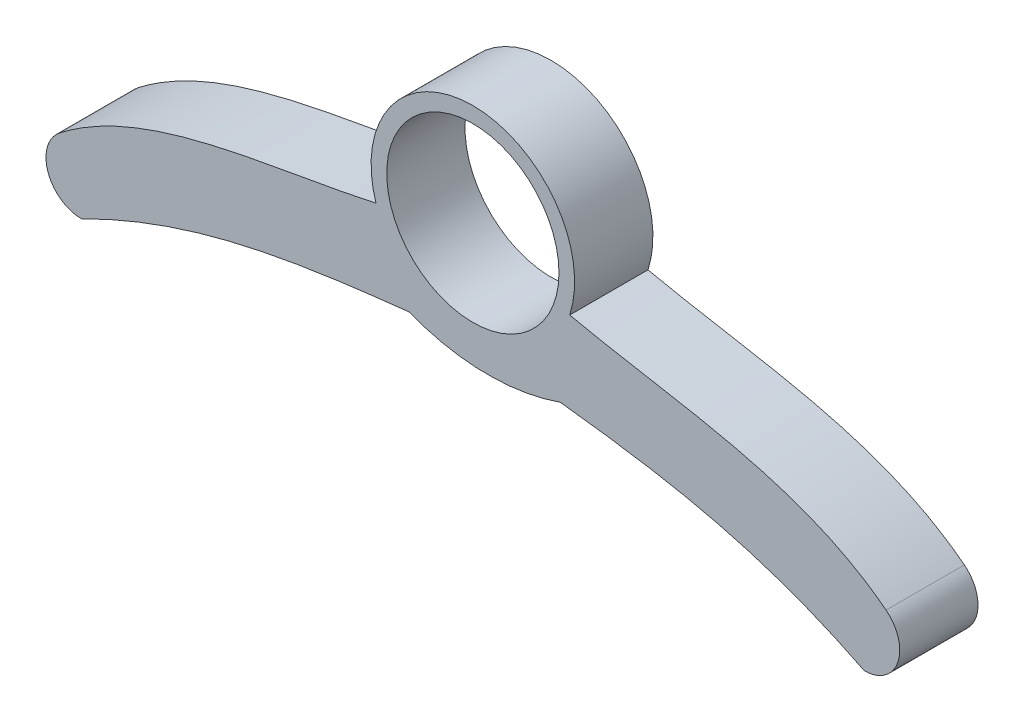
ISO-10303-21;
HEADER;
FILE_DESCRIPTION(('STEP AP214'),'2;1');
FILE_NAME('part.step','',(''),(''),'','','');
FILE_SCHEMA(('AUTOMOTIVE_DESIGN { 1 0 10303 214 1 1 1 1 }'));
ENDSEC;
DATA;
#1=APPLICATION_CONTEXT('core data for automotive mechanical design processes');
#2=APPLICATION_PROTOCOL_DEFINITION('international standard','automotive_design',2000,#1);
#3=PRODUCT_CONTEXT('',#1,'mechanical');
#4=PRODUCT('Part','Part','',(#3));
#5=PRODUCT_RELATED_PRODUCT_CATEGORY('part','',(#4));
#6=PRODUCT_DEFINITION_FORMATION('','',#4);
#7=PRODUCT_DEFINITION_CONTEXT('part definition',#1,'design');
#8=PRODUCT_DEFINITION('design','',#6,#7);
#9=PRODUCT_DEFINITION_SHAPE('','',#8);
#10=(LENGTH_UNIT() NAMED_UNIT(*) SI_UNIT(.MILLI.,.METRE.));
#11=(NAMED_UNIT(*) PLANE_ANGLE_UNIT() SI_UNIT($,.RADIAN.));
#12=(NAMED_UNIT(*) SI_UNIT($,.STERADIAN.) SOLID_ANGLE_UNIT());
#13=UNCERTAINTY_MEASURE_WITH_UNIT(LENGTH_MEASURE(1.E-05),#10,'distance_accuracy_value','');
#14=(GEOMETRIC_REPRESENTATION_CONTEXT(3) GLOBAL_UNCERTAINTY_ASSIGNED_CONTEXT((#13)) GLOBAL_UNIT_ASSIGNED_CONTEXT((#10,
#11,#12)) REPRESENTATION_CONTEXT('',''));
#15=CARTESIAN_POINT('',(0.,0.,0.));
#16=DIRECTION('',(0.,0.,1.));
#17=DIRECTION('',(1.,0.,0.));
#18=AXIS2_PLACEMENT_3D('',#15,#16,#17);
#19=CARTESIAN_POINT('',(-49.9999999999999,-20.,10.));
#20=DIRECTION('',(0.,0.,-1.));
#21=DIRECTION('',(-1.,0.,0.));
#22=AXIS2_PLACEMENT_3D('',#19,#20,#21);
#23=CYLINDRICAL_SURFACE('',#22,4.52880517586229);
#24=CARTESIAN_POINT('',(-49.9999999999999,-20.,0.));
#25=DIRECTION('',(0.,0.,1.));
#26=DIRECTION('',(1.,0.,0.));
#27=AXIS2_PLACEMENT_3D('',#24,#25,#26);
#28=CIRCLE('',#27,4.52880517586229);
#29=CARTESIAN_POINT('',(-52.7829726265033,-16.4271664352996,0.));
#30=VERTEX_POINT('',#29);
#31=CARTESIAN_POINT('',(-50.,-24.5288051758623,0.));
#32=VERTEX_POINT('',#31);
#33=EDGE_CURVE('E181',#30,#32,#28,.T.);
#34=ORIENTED_EDGE('',*,*,#33,.T.);
#35=DIRECTION('',(0.,0.,-1.));
#36=VECTOR('',#35,1.);
#37=CARTESIAN_POINT('',(-50.,-24.5288051758623,10.));
#38=LINE('',#37,#36);
#39=CARTESIAN_POINT('',(-50.,-24.5288051758623,10.));
#40=VERTEX_POINT('',#39);
#41=EDGE_CURVE('E11',#40,#32,#38,.T.);
#42=ORIENTED_EDGE('',*,*,#41,.F.);
#43=CARTESIAN_POINT('',(-49.9999999999999,-20.,10.));
#44=DIRECTION('',(0.,0.,1.));
#45=DIRECTION('',(1.,0.,0.));
#46=AXIS2_PLACEMENT_3D('',#43,#44,#45);
#47=CIRCLE('',#46,4.52880517586229);
#48=CARTESIAN_POINT('',(-52.7829726265033,-16.4271664352996,10.));
#49=VERTEX_POINT('',#48);
#50=EDGE_CURVE('E167',#49,#40,#47,.T.);
#51=ORIENTED_EDGE('',*,*,#50,.F.);
#52=DIRECTION('',(0.,0.,-1.));
#53=VECTOR('',#52,1.);
#54=CARTESIAN_POINT('',(-52.7829726265033,-16.4271664352996,10.));
#55=LINE('',#54,#53);
#56=EDGE_CURVE('E183',#49,#30,#55,.T.);
#57=ORIENTED_EDGE('',*,*,#56,.T.);
#58=EDGE_LOOP('',(#34,#42,#51,#57));
#59=FACE_BOUND('',#58,.T.);
#60=ADVANCED_FACE('F35',(#59),#23,.T.);
#61=CARTESIAN_POINT('',(-50.,-24.5288051758623,10.));
#62=CARTESIAN_POINT('',(-33.0715845553346,-16.0074155927241,10.));
#63=CARTESIAN_POINT('',(-18.4568769413616,-15.1064743602897,10.));
#64=CARTESIAN_POINT('',(0.,-13.,10.));
#65=B_SPLINE_CURVE_WITH_KNOTS('',3,(#61,#62,#63,#64),.UNSPECIFIED.,.F.,.F.,(4,4),(0.,1.),.UNSPECIFIED.);
#66=DIRECTION('',(0.,0.,-1.));
#67=VECTOR('',#66,1.);
#68=SURFACE_OF_LINEAR_EXTRUSION('',#65,#67);
#69=CARTESIAN_POINT('',(-50.,-24.5288051758623,0.));
#70=CARTESIAN_POINT('',(-33.0715845553346,-16.0074155927241,0.));
#71=CARTESIAN_POINT('',(-18.4568769413616,-15.1064743602897,0.));
#72=CARTESIAN_POINT('',(0.,-13.,0.));
#73=B_SPLINE_CURVE_WITH_KNOTS('',3,(#69,#70,#71,#72),.UNSPECIFIED.,.F.,.F.,(4,4),(0.,1.),.UNSPECIFIED.);
#74=CARTESIAN_POINT('',(-8.16898612413524,-13.9076929567843,0.));
#75=VERTEX_POINT('',#74);
#76=EDGE_CURVE('E185',#32,#75,#73,.T.);
#77=ORIENTED_EDGE('',*,*,#76,.T.);
#78=DIRECTION('',(0.,0.,-1.));
#79=VECTOR('',#78,1.);
#80=CARTESIAN_POINT('',(-8.16898612413524,-13.9076929567843,10.));
#81=LINE('',#80,#79);
#82=CARTESIAN_POINT('',(-8.16898612413524,-13.9076929567843,10.));
#83=VERTEX_POINT('',#82);
#84=EDGE_CURVE('E44',#83,#75,#81,.T.);
#85=ORIENTED_EDGE('',*,*,#84,.F.);
#86=EDGE_CURVE('E94',#40,#83,#65,.T.);
#87=ORIENTED_EDGE('',*,*,#86,.F.);
#88=ORIENTED_EDGE('',*,*,#41,.T.);
#89=EDGE_LOOP('',(#77,#85,#87,#88));
#90=FACE_BOUND('',#89,.T.);
#91=ADVANCED_FACE('F172',(#90),#68,.F.);
#92=CARTESIAN_POINT('',(1.95293040160297,11.9761529949238,10.));
#93=DIRECTION('',(0.,0.,-1.));
#94=DIRECTION('',(-1.,0.,0.));
#95=AXIS2_PLACEMENT_3D('',#92,#93,#94);
#96=CYLINDRICAL_SURFACE('',#95,27.7925651102191);
#97=CARTESIAN_POINT('',(1.95293040160297,11.9761529949238,0.));
#98=DIRECTION('',(0.,0.,1.));
#99=DIRECTION('',(1.,0.,0.));
#100=AXIS2_PLACEMENT_3D('',#97,#98,#99);
#101=CIRCLE('',#100,27.7925651102191);
#102=CARTESIAN_POINT('',(11.159249547059,-14.2473167068105,0.));
#103=VERTEX_POINT('',#102);
#104=EDGE_CURVE('E188',#75,#103,#101,.T.);
#105=ORIENTED_EDGE('',*,*,#104,.T.);
#106=DIRECTION('',(0.,0.,-1.));
#107=VECTOR('',#106,1.);
#108=CARTESIAN_POINT('',(11.159249547059,-14.2473167068105,10.));
#109=LINE('',#108,#107);
#110=CARTESIAN_POINT('',(11.159249547059,-14.2473167068105,10.));
#111=VERTEX_POINT('',#110);
#112=EDGE_CURVE('E230',#111,#103,#109,.T.);
#113=ORIENTED_EDGE('',*,*,#112,.F.);
#114=CARTESIAN_POINT('',(1.95293040160297,11.9761529949238,10.));
#115=DIRECTION('',(0.,0.,1.));
#116=DIRECTION('',(1.,0.,0.));
#117=AXIS2_PLACEMENT_3D('',#114,#115,#116);
#118=CIRCLE('',#117,27.7925651102191);
#119=EDGE_CURVE('E158',#83,#111,#118,.T.);
#120=ORIENTED_EDGE('',*,*,#119,.F.);
#121=ORIENTED_EDGE('',*,*,#84,.T.);
#122=EDGE_LOOP('',(#105,#113,#120,#121));
#123=FACE_BOUND('',#122,.T.);
#124=ADVANCED_FACE('F150',(#123),#96,.T.);
#125=CARTESIAN_POINT('',(50.,-24.5288051758623,10.));
#126=CARTESIAN_POINT('',(33.0715845553346,-16.0074155927241,10.));
#127=CARTESIAN_POINT('',(18.4568769413616,-15.1064743602897,10.));
#128=CARTESIAN_POINT('',(0.,-13.,10.));
#129=B_SPLINE_CURVE_WITH_KNOTS('',3,(#125,#126,#127,#128),.UNSPECIFIED.,.F.,.F.,(4,4),(0.,1.),.UNSPECIFIED.);
#130=DIRECTION('',(0.,0.,-1.));
#131=VECTOR('',#130,1.);
#132=SURFACE_OF_LINEAR_EXTRUSION('',#129,#131);
#133=CARTESIAN_POINT('',(50.,-24.5288051758623,0.));
#134=CARTESIAN_POINT('',(33.0715845553346,-16.0074155927241,0.));
#135=CARTESIAN_POINT('',(18.4568769413616,-15.1064743602897,0.));
#136=CARTESIAN_POINT('',(0.,-13.,0.));
#137=B_SPLINE_CURVE_WITH_KNOTS('',3,(#133,#134,#135,#136),.UNSPECIFIED.,.F.,.F.,(4,4),(0.,1.),.UNSPECIFIED.);
#138=CARTESIAN_POINT('',(50.,-24.5288051758623,0.));
#139=VERTEX_POINT('',#138);
#140=EDGE_CURVE('E200',#139,#103,#137,.T.);
#141=ORIENTED_EDGE('',*,*,#140,.F.);
#142=DIRECTION('',(0.,0.,-1.));
#143=VECTOR('',#142,1.);
#144=CARTESIAN_POINT('',(50.,-24.5288051758623,10.));
#145=LINE('',#144,#143);
#146=CARTESIAN_POINT('',(50.,-24.5288051758623,10.));
#147=VERTEX_POINT('',#146);
#148=EDGE_CURVE('E228',#147,#139,#145,.T.);
#149=ORIENTED_EDGE('',*,*,#148,.F.);
#150=EDGE_CURVE('E128',#147,#111,#129,.T.);
#151=ORIENTED_EDGE('',*,*,#150,.T.);
#152=ORIENTED_EDGE('',*,*,#112,.T.);
#153=EDGE_LOOP('',(#141,#149,#151,#152));
#154=FACE_BOUND('',#153,.T.);
#155=ADVANCED_FACE('F146',(#154),#132,.T.);
#156=CARTESIAN_POINT('',(49.9999999999999,-20.,10.));
#157=DIRECTION('',(0.,0.,-1.));
#158=DIRECTION('',(-1.,0.,0.));
#159=AXIS2_PLACEMENT_3D('',#156,#157,#158);
#160=CYLINDRICAL_SURFACE('',#159,4.52880517586229);
#161=CARTESIAN_POINT('',(49.9999999999999,-20.,0.));
#162=DIRECTION('',(0.,0.,1.));
#163=DIRECTION('',(1.,0.,0.));
#164=AXIS2_PLACEMENT_3D('',#161,#162,#163);
#165=CIRCLE('',#164,4.52880517586229);
#166=CARTESIAN_POINT('',(52.7829726265033,-16.4271664352996,0.));
#167=VERTEX_POINT('',#166);
#168=EDGE_CURVE('E205',#167,#139,#165,.F.);
#169=ORIENTED_EDGE('',*,*,#168,.F.);
#170=DIRECTION('',(0.,0.,-1.));
#171=VECTOR('',#170,1.);
#172=CARTESIAN_POINT('',(52.7829726265033,-16.4271664352996,10.));
#173=LINE('',#172,#171);
#174=CARTESIAN_POINT('',(52.7829726265033,-16.4271664352996,10.));
#175=VERTEX_POINT('',#174);
#176=EDGE_CURVE('E116',#175,#167,#173,.T.);
#177=ORIENTED_EDGE('',*,*,#176,.F.);
#178=CARTESIAN_POINT('',(49.9999999999999,-20.,10.));
#179=DIRECTION('',(0.,0.,1.));
#180=DIRECTION('',(1.,0.,0.));
#181=AXIS2_PLACEMENT_3D('',#178,#179,#180);
#182=CIRCLE('',#181,4.52880517586229);
#183=EDGE_CURVE('E126',#175,#147,#182,.F.);
#184=ORIENTED_EDGE('',*,*,#183,.T.);
#185=ORIENTED_EDGE('',*,*,#148,.T.);
#186=EDGE_LOOP('',(#169,#177,#184,#185));
#187=FACE_BOUND('',#186,.T.);
#188=ADVANCED_FACE('F142',(#187),#160,.T.);
#189=CARTESIAN_POINT('',(0.,0.,10.));
#190=CARTESIAN_POINT('',(15.4923764911296,-7.37267141083325,10.));
#191=CARTESIAN_POINT('',(38.086817466896,-4.97995044177684,10.));
#192=CARTESIAN_POINT('',(52.7829726265033,-16.4271664352996,10.));
#193=B_SPLINE_CURVE_WITH_KNOTS('',3,(#189,#190,#191,#192),.UNSPECIFIED.,.F.,.F.,(4,4),(0.,1.),.UNSPECIFIED.);
#194=DIRECTION('',(0.,0.,-1.));
#195=VECTOR('',#194,1.);
#196=SURFACE_OF_LINEAR_EXTRUSION('',#193,#195);
#197=CARTESIAN_POINT('',(0.,0.,0.));
#198=CARTESIAN_POINT('',(15.4923764911296,-7.37267141083325,0.));
#199=CARTESIAN_POINT('',(38.086817466896,-4.97995044177684,0.));
#200=CARTESIAN_POINT('',(52.7829726265033,-16.4271664352996,0.));
#201=B_SPLINE_CURVE_WITH_KNOTS('',3,(#197,#198,#199,#200),.UNSPECIFIED.,.F.,.F.,(4,4),(0.,1.),.UNSPECIFIED.);
#202=CARTESIAN_POINT('',(12.3721165413245,-3.99133214452062,0.));
#203=VERTEX_POINT('',#202);
#204=EDGE_CURVE('E115',#203,#167,#201,.T.);
#205=ORIENTED_EDGE('',*,*,#204,.F.);
#206=DIRECTION('',(0.,0.,-1.));
#207=VECTOR('',#206,1.);
#208=CARTESIAN_POINT('',(12.3721165413245,-3.99133214452062,10.));
#209=LINE('',#208,#207);
#210=CARTESIAN_POINT('',(12.3721165413245,-3.99133214452062,10.));
#211=VERTEX_POINT('',#210);
#212=EDGE_CURVE('E109',#211,#203,#209,.T.);
#213=ORIENTED_EDGE('',*,*,#212,.F.);
#214=EDGE_CURVE('E113',#211,#175,#193,.T.);
#215=ORIENTED_EDGE('',*,*,#214,.T.);
#216=ORIENTED_EDGE('',*,*,#176,.T.);
#217=EDGE_LOOP('',(#205,#213,#215,#216));
#218=FACE_BOUND('',#217,.T.);
#219=ADVANCED_FACE('F111',(#218),#196,.T.);
#220=CARTESIAN_POINT('',(0.,0.,10.));
#221=DIRECTION('',(0.,0.,-1.));
#222=DIRECTION('',(-1.,0.,0.));
#223=AXIS2_PLACEMENT_3D('',#220,#221,#222);
#224=CYLINDRICAL_SURFACE('',#223,13.);
#225=CARTESIAN_POINT('',(0.,0.,0.));
#226=DIRECTION('',(0.,0.,1.));
#227=DIRECTION('',(1.,0.,0.));
#228=AXIS2_PLACEMENT_3D('',#225,#226,#227);
#229=CIRCLE('',#228,13.);
#230=CARTESIAN_POINT('',(-12.3721165413245,-3.99133214452062,0.));
#231=VERTEX_POINT('',#230);
#232=EDGE_CURVE('E80',#203,#231,#229,.T.);
#233=ORIENTED_EDGE('',*,*,#232,.T.);
#234=DIRECTION('',(0.,0.,-1.));
#235=VECTOR('',#234,1.);
#236=CARTESIAN_POINT('',(-12.3721165413245,-3.99133214452062,10.));
#237=LINE('',#236,#235);
#238=CARTESIAN_POINT('',(-12.3721165413245,-3.99133214452062,10.));
#239=VERTEX_POINT('',#238);
#240=EDGE_CURVE('E117',#239,#231,#237,.T.);
#241=ORIENTED_EDGE('',*,*,#240,.F.);
#242=CARTESIAN_POINT('',(0.,0.,10.));
#243=DIRECTION('',(0.,0.,1.));
#244=DIRECTION('',(1.,0.,0.));
#245=AXIS2_PLACEMENT_3D('',#242,#243,#244);
#246=CIRCLE('',#245,13.);
#247=EDGE_CURVE('E119',#211,#239,#246,.T.);
#248=ORIENTED_EDGE('',*,*,#247,.F.);
#249=ORIENTED_EDGE('',*,*,#212,.T.);
#250=EDGE_LOOP('',(#233,#241,#248,#249));
#251=FACE_BOUND('',#250,.T.);
#252=ADVANCED_FACE('F120',(#251),#224,.T.);
#253=CARTESIAN_POINT('',(0.,0.,10.));
#254=DIRECTION('',(0.,0.,-1.));
#255=DIRECTION('',(-1.,0.,0.));
#256=AXIS2_PLACEMENT_3D('',#253,#254,#255);
#257=CYLINDRICAL_SURFACE('',#256,11.);
#258=CARTESIAN_POINT('',(0.,0.,10.));
#259=DIRECTION('',(0.,0.,1.));
#260=DIRECTION('',(1.,0.,0.));
#261=AXIS2_PLACEMENT_3D('',#258,#259,#260);
#262=CIRCLE('',#261,11.);
#263=CARTESIAN_POINT('',(11.,0.,10.));
#264=VERTEX_POINT('',#263);
#265=EDGE_CURVE('E221',#264,#264,#262,.T.);
#266=ORIENTED_EDGE('',*,*,#265,.T.);
#267=EDGE_LOOP('',(#266));
#268=FACE_BOUND('',#267,.T.);
#269=CARTESIAN_POINT('',(0.,0.,0.));
#270=DIRECTION('',(0.,0.,1.));
#271=DIRECTION('',(1.,0.,0.));
#272=AXIS2_PLACEMENT_3D('',#269,#270,#271);
#273=CIRCLE('',#272,11.);
#274=CARTESIAN_POINT('',(11.,0.,0.));
#275=VERTEX_POINT('',#274);
#276=EDGE_CURVE('E186',#275,#275,#273,.T.);
#277=ORIENTED_EDGE('',*,*,#276,.F.);
#278=EDGE_LOOP('',(#277));
#279=FACE_BOUND('',#278,.T.);
#280=ADVANCED_FACE('F37',(#268,#279),#257,.F.);
#281=CARTESIAN_POINT('',(0.,0.,10.));
#282=CARTESIAN_POINT('',(-15.4923764911296,-7.37267141083325,10.));
#283=CARTESIAN_POINT('',(-38.086817466896,-4.97995044177684,10.));
#284=CARTESIAN_POINT('',(-52.7829726265033,-16.4271664352996,10.));
#285=B_SPLINE_CURVE_WITH_KNOTS('',3,(#281,#282,#283,#284),.UNSPECIFIED.,.F.,.F.,(4,4),(0.,1.),.UNSPECIFIED.);
#286=DIRECTION('',(0.,0.,-1.));
#287=VECTOR('',#286,1.);
#288=SURFACE_OF_LINEAR_EXTRUSION('',#285,#287);
#289=CARTESIAN_POINT('',(0.,0.,0.));
#290=CARTESIAN_POINT('',(-15.4923764911296,-7.37267141083325,0.));
#291=CARTESIAN_POINT('',(-38.086817466896,-4.97995044177684,0.));
#292=CARTESIAN_POINT('',(-52.7829726265033,-16.4271664352996,0.));
#293=B_SPLINE_CURVE_WITH_KNOTS('',3,(#289,#290,#291,#292),.UNSPECIFIED.,.F.,.F.,(4,4),(0.,1.),.UNSPECIFIED.);
#294=EDGE_CURVE('E86',#231,#30,#293,.T.);
#295=ORIENTED_EDGE('',*,*,#294,.T.);
#296=ORIENTED_EDGE('',*,*,#56,.F.);
#297=EDGE_CURVE('E52',#239,#49,#285,.T.);
#298=ORIENTED_EDGE('',*,*,#297,.F.);
#299=ORIENTED_EDGE('',*,*,#240,.T.);
#300=EDGE_LOOP('',(#295,#296,#298,#299));
#301=FACE_BOUND('',#300,.T.);
#302=ADVANCED_FACE('F245',(#301),#288,.F.);
#303=CARTESIAN_POINT('',(0.,0.,10.));
#304=DIRECTION('',(0.,0.,1.));
#305=DIRECTION('',(1.,0.,0.));
#306=AXIS2_PLACEMENT_3D('',#303,#304,#305);
#307=PLANE('',#306);
#308=ORIENTED_EDGE('',*,*,#265,.F.);
#309=EDGE_LOOP('',(#308));
#310=FACE_BOUND('',#309,.T.);
#311=ORIENTED_EDGE('',*,*,#50,.T.);
#312=ORIENTED_EDGE('',*,*,#86,.T.);
#313=ORIENTED_EDGE('',*,*,#119,.T.);
#314=ORIENTED_EDGE('',*,*,#150,.F.);
#315=ORIENTED_EDGE('',*,*,#183,.F.);
#316=ORIENTED_EDGE('',*,*,#214,.F.);
#317=ORIENTED_EDGE('',*,*,#247,.T.);
#318=ORIENTED_EDGE('',*,*,#297,.T.);
#319=EDGE_LOOP('',(#311,#312,#313,#314,#315,#316,#317,#318));
#320=FACE_BOUND('',#319,.T.);
#321=ADVANCED_FACE('F123',(#310,#320),#307,.T.);
#322=CARTESIAN_POINT('',(0.,0.,0.));
#323=DIRECTION('',(0.,0.,1.));
#324=DIRECTION('',(1.,0.,0.));
#325=AXIS2_PLACEMENT_3D('',#322,#323,#324);
#326=PLANE('',#325);
#327=ORIENTED_EDGE('',*,*,#276,.T.);
#328=EDGE_LOOP('',(#327));
#329=FACE_BOUND('',#328,.T.);
#330=ORIENTED_EDGE('',*,*,#33,.F.);
#331=ORIENTED_EDGE('',*,*,#294,.F.);
#332=ORIENTED_EDGE('',*,*,#232,.F.);
#333=ORIENTED_EDGE('',*,*,#204,.T.);
#334=ORIENTED_EDGE('',*,*,#168,.T.);
#335=ORIENTED_EDGE('',*,*,#140,.T.);
#336=ORIENTED_EDGE('',*,*,#104,.F.);
#337=ORIENTED_EDGE('',*,*,#76,.F.);
#338=EDGE_LOOP('',(#330,#331,#332,#333,#334,#335,#336,#337));
#339=FACE_BOUND('',#338,.T.);
#340=ADVANCED_FACE('F236',(#329,#339),#326,.F.);
#341=CLOSED_SHELL('',(#60,#91,#124,#155,#188,#219,#252,#280,#302,#321,#340));
#342=MANIFOLD_SOLID_BREP('B2',#341);
#343=ADVANCED_BREP_SHAPE_REPRESENTATION('',(#18,#342),#14);
#344=SHAPE_DEFINITION_REPRESENTATION(#9,#343);
ENDSEC;
END-ISO-10303-21;
